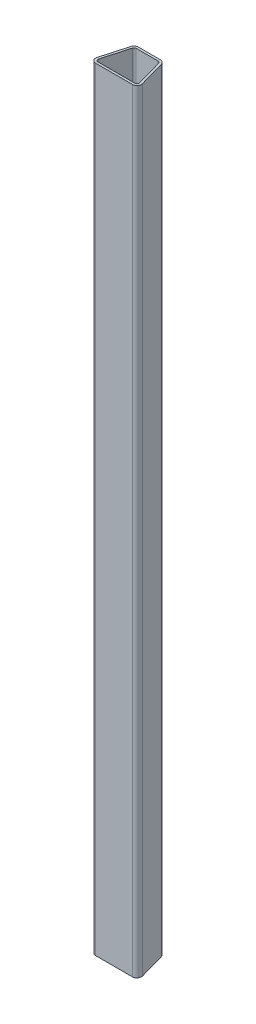
ISO-10303-21;
HEADER;
FILE_DESCRIPTION(('STEP AP214'),'2;1');
FILE_NAME('part.step','',(''),(''),'','','');
FILE_SCHEMA(('AUTOMOTIVE_DESIGN { 1 0 10303 214 1 1 1 1 }'));
ENDSEC;
DATA;
#1=APPLICATION_CONTEXT('core data for automotive mechanical design processes');
#2=APPLICATION_PROTOCOL_DEFINITION('international standard','automotive_design',2000,#1);
#3=PRODUCT_CONTEXT('',#1,'mechanical');
#4=PRODUCT('Part','Part','',(#3));
#5=PRODUCT_RELATED_PRODUCT_CATEGORY('part','',(#4));
#6=PRODUCT_DEFINITION_FORMATION('','',#4);
#7=PRODUCT_DEFINITION_CONTEXT('part definition',#1,'design');
#8=PRODUCT_DEFINITION('design','',#6,#7);
#9=PRODUCT_DEFINITION_SHAPE('','',#8);
#10=(LENGTH_UNIT() NAMED_UNIT(*) SI_UNIT(.MILLI.,.METRE.));
#11=(NAMED_UNIT(*) PLANE_ANGLE_UNIT() SI_UNIT($,.RADIAN.));
#12=(NAMED_UNIT(*) SI_UNIT($,.STERADIAN.) SOLID_ANGLE_UNIT());
#13=UNCERTAINTY_MEASURE_WITH_UNIT(LENGTH_MEASURE(1.E-05),#10,'distance_accuracy_value','');
#14=(GEOMETRIC_REPRESENTATION_CONTEXT(3) GLOBAL_UNCERTAINTY_ASSIGNED_CONTEXT((#13)) GLOBAL_UNIT_ASSIGNED_CONTEXT((#10,
#11,#12)) REPRESENTATION_CONTEXT('',''));
#15=CARTESIAN_POINT('',(0.,0.,0.));
#16=DIRECTION('',(0.,0.,1.));
#17=DIRECTION('',(1.,0.,0.));
#18=AXIS2_PLACEMENT_3D('',#15,#16,#17);
#19=CARTESIAN_POINT('',(-4.98490373267567,350.,-6.));
#20=DIRECTION('',(0.,-1.,0.));
#21=DIRECTION('',(0.,0.,-1.));
#22=AXIS2_PLACEMENT_3D('',#19,#20,#21);
#23=CYLINDRICAL_SURFACE('',#22,0.999999999999999);
#24=DIRECTION('',(0.,1.,0.));
#25=VECTOR('',#24,1.);
#26=CARTESIAN_POINT('',(-4.98490373267567,350.,-7.));
#27=LINE('',#26,#25);
#28=CARTESIAN_POINT('',(-4.98490373267567,350.,-7.));
#29=VERTEX_POINT('',#28);
#30=CARTESIAN_POINT('',(-4.98490373267567,0.,-7.));
#31=VERTEX_POINT('',#30);
#32=EDGE_CURVE('E134',#29,#31,#27,.F.);
#33=ORIENTED_EDGE('',*,*,#32,.F.);
#34=CARTESIAN_POINT('',(-4.98490373267567,350.,-6.));
#35=DIRECTION('',(0.,-1.,0.));
#36=DIRECTION('',(0.,0.,-1.));
#37=AXIS2_PLACEMENT_3D('',#34,#35,#36);
#38=CIRCLE('',#37,0.999999999999999);
#39=CARTESIAN_POINT('',(-5.94755467282956,350.,-6.27074557691828));
#40=VERTEX_POINT('',#39);
#41=EDGE_CURVE('E20',#40,#29,#38,.T.);
#42=ORIENTED_EDGE('',*,*,#41,.F.);
#43=DIRECTION('',(0.,1.,0.));
#44=VECTOR('',#43,1.);
#45=CARTESIAN_POINT('',(-5.94755467282956,350.,-6.27074557691828));
#46=LINE('',#45,#44);
#47=CARTESIAN_POINT('',(-5.94755467282956,0.,-6.27074557691828));
#48=VERTEX_POINT('',#47);
#49=EDGE_CURVE('E179',#48,#40,#46,.T.);
#50=ORIENTED_EDGE('',*,*,#49,.F.);
#51=CARTESIAN_POINT('',(-4.98490373267567,0.,-6.));
#52=DIRECTION('',(0.,-1.,0.));
#53=DIRECTION('',(0.,0.,-1.));
#54=AXIS2_PLACEMENT_3D('',#51,#52,#53);
#55=CIRCLE('',#54,0.999999999999999);
#56=EDGE_CURVE('E132',#31,#48,#55,.F.);
#57=ORIENTED_EDGE('',*,*,#56,.F.);
#58=EDGE_LOOP('',(#33,#42,#50,#57));
#59=FACE_BOUND('',#58,.T.);
#60=ADVANCED_FACE('F17',(#59),#23,.F.);
#61=CARTESIAN_POINT('',(4.98490373267567,350.,-6.));
#62=DIRECTION('',(0.,-1.,0.));
#63=DIRECTION('',(0.,0.,-1.));
#64=AXIS2_PLACEMENT_3D('',#61,#62,#63);
#65=CYLINDRICAL_SURFACE('',#64,0.999999999999998);
#66=DIRECTION('',(0.,1.,0.));
#67=VECTOR('',#66,1.);
#68=CARTESIAN_POINT('',(5.94755467282956,350.,-6.27074557691828));
#69=LINE('',#68,#67);
#70=CARTESIAN_POINT('',(5.94755467282956,350.,-6.27074557691828));
#71=VERTEX_POINT('',#70);
#72=CARTESIAN_POINT('',(5.94755467282956,0.,-6.27074557691828));
#73=VERTEX_POINT('',#72);
#74=EDGE_CURVE('E138',#71,#73,#69,.F.);
#75=ORIENTED_EDGE('',*,*,#74,.F.);
#76=CARTESIAN_POINT('',(4.98490373267567,350.,-6.));
#77=DIRECTION('',(0.,-1.,0.));
#78=DIRECTION('',(0.,0.,-1.));
#79=AXIS2_PLACEMENT_3D('',#76,#77,#78);
#80=CIRCLE('',#79,0.999999999999998);
#81=CARTESIAN_POINT('',(4.98490373267567,350.,-7.));
#82=VERTEX_POINT('',#81);
#83=EDGE_CURVE('E227',#82,#71,#80,.T.);
#84=ORIENTED_EDGE('',*,*,#83,.F.);
#85=DIRECTION('',(0.,1.,0.));
#86=VECTOR('',#85,1.);
#87=CARTESIAN_POINT('',(4.98490373267567,350.,-7.));
#88=LINE('',#87,#86);
#89=CARTESIAN_POINT('',(4.98490373267567,0.,-7.));
#90=VERTEX_POINT('',#89);
#91=EDGE_CURVE('E139',#90,#82,#88,.T.);
#92=ORIENTED_EDGE('',*,*,#91,.F.);
#93=CARTESIAN_POINT('',(4.98490373267567,0.,-6.));
#94=DIRECTION('',(0.,-1.,0.));
#95=DIRECTION('',(0.,0.,-1.));
#96=AXIS2_PLACEMENT_3D('',#93,#94,#95);
#97=CIRCLE('',#96,0.999999999999998);
#98=EDGE_CURVE('E195',#73,#90,#97,.F.);
#99=ORIENTED_EDGE('',*,*,#98,.F.);
#100=EDGE_LOOP('',(#75,#84,#92,#99));
#101=FACE_BOUND('',#100,.T.);
#102=ADVANCED_FACE('F425',(#101),#65,.F.);
#103=CARTESIAN_POINT('',(6.91020561298346,350.,-6.54149115383657));
#104=DIRECTION('',(-0.962650940153899,0.,0.270745576918284));
#105=DIRECTION('',(0.270745576918284,0.,0.962650940153899));
#106=AXIS2_PLACEMENT_3D('',#103,#104,#105);
#107=PLANE('',#106);
#108=DIRECTION('',(0.,-1.,0.));
#109=VECTOR('',#108,1.);
#110=CARTESIAN_POINT('',(6.91020561298346,350.,-6.54149115383657));
#111=LINE('',#110,#109);
#112=CARTESIAN_POINT('',(6.91020561298346,350.,-6.54149115383657));
#113=VERTEX_POINT('',#112);
#114=CARTESIAN_POINT('',(6.91020561298346,0.,-6.54149115383657));
#115=VERTEX_POINT('',#114);
#116=EDGE_CURVE('E193',#113,#115,#111,.T.);
#117=ORIENTED_EDGE('',*,*,#116,.F.);
#118=DIRECTION('',(-0.270745576918284,0.,-0.962650940153899));
#119=VECTOR('',#118,1.);
#120=CARTESIAN_POINT('',(10.2852056129835,350.,5.45850884616343));
#121=LINE('',#120,#119);
#122=CARTESIAN_POINT('',(10.2852056129835,350.,5.45850884616343));
#123=VERTEX_POINT('',#122);
#124=EDGE_CURVE('E161',#123,#113,#121,.T.);
#125=ORIENTED_EDGE('',*,*,#124,.F.);
#126=DIRECTION('',(0.,-1.,0.));
#127=VECTOR('',#126,1.);
#128=CARTESIAN_POINT('',(10.2852056129835,350.,5.45850884616343));
#129=LINE('',#128,#127);
#130=CARTESIAN_POINT('',(10.2852056129835,0.,5.45850884616343));
#131=VERTEX_POINT('',#130);
#132=EDGE_CURVE('E182',#131,#123,#129,.F.);
#133=ORIENTED_EDGE('',*,*,#132,.F.);
#134=DIRECTION('',(-0.270745576918284,0.,-0.962650940153899));
#135=VECTOR('',#134,1.);
#136=CARTESIAN_POINT('',(10.2852056129835,0.,5.45850884616343));
#137=LINE('',#136,#135);
#138=EDGE_CURVE('E218',#131,#115,#137,.T.);
#139=ORIENTED_EDGE('',*,*,#138,.T.);
#140=EDGE_LOOP('',(#117,#125,#133,#139));
#141=FACE_BOUND('',#140,.T.);
#142=ADVANCED_FACE('F269',(#141),#107,.F.);
#143=CARTESIAN_POINT('',(4.98490373267567,350.,-6.));
#144=DIRECTION('',(0.,-1.,0.));
#145=DIRECTION('',(0.,0.,-1.));
#146=AXIS2_PLACEMENT_3D('',#143,#144,#145);
#147=CYLINDRICAL_SURFACE('',#146,2.);
#148=CARTESIAN_POINT('',(4.98490373267567,350.,-6.));
#149=DIRECTION('',(0.,-1.,0.));
#150=DIRECTION('',(0.,0.,-1.));
#151=AXIS2_PLACEMENT_3D('',#148,#149,#150);
#152=CIRCLE('',#151,2.);
#153=CARTESIAN_POINT('',(4.98490373267567,350.,-8.));
#154=VERTEX_POINT('',#153);
#155=EDGE_CURVE('E160',#113,#154,#152,.F.);
#156=ORIENTED_EDGE('',*,*,#155,.F.);
#157=ORIENTED_EDGE('',*,*,#116,.T.);
#158=CARTESIAN_POINT('',(4.98490373267567,0.,-6.));
#159=DIRECTION('',(0.,-1.,0.));
#160=DIRECTION('',(0.,0.,-1.));
#161=AXIS2_PLACEMENT_3D('',#158,#159,#160);
#162=CIRCLE('',#161,2.);
#163=CARTESIAN_POINT('',(4.98490373267567,0.,-8.));
#164=VERTEX_POINT('',#163);
#165=EDGE_CURVE('E215',#115,#164,#162,.F.);
#166=ORIENTED_EDGE('',*,*,#165,.T.);
#167=DIRECTION('',(0.,1.,0.));
#168=VECTOR('',#167,1.);
#169=CARTESIAN_POINT('',(4.98490373267567,350.,-8.));
#170=LINE('',#169,#168);
#171=EDGE_CURVE('E190',#164,#154,#170,.T.);
#172=ORIENTED_EDGE('',*,*,#171,.T.);
#173=EDGE_LOOP('',(#156,#157,#166,#172));
#174=FACE_BOUND('',#173,.T.);
#175=ADVANCED_FACE('F274',(#174),#147,.T.);
#176=CARTESIAN_POINT('',(-4.98490373267567,350.,-8.));
#177=DIRECTION('',(0.,0.,1.));
#178=DIRECTION('',(1.,0.,0.));
#179=AXIS2_PLACEMENT_3D('',#176,#177,#178);
#180=PLANE('',#179);
#181=DIRECTION('',(0.,-1.,0.));
#182=VECTOR('',#181,1.);
#183=CARTESIAN_POINT('',(-4.98490373267567,350.,-8.));
#184=LINE('',#183,#182);
#185=CARTESIAN_POINT('',(-4.98490373267567,350.,-8.));
#186=VERTEX_POINT('',#185);
#187=CARTESIAN_POINT('',(-4.98490373267567,0.,-8.));
#188=VERTEX_POINT('',#187);
#189=EDGE_CURVE('E188',#186,#188,#184,.T.);
#190=ORIENTED_EDGE('',*,*,#189,.F.);
#191=DIRECTION('',(1.,0.,0.));
#192=VECTOR('',#191,1.);
#193=CARTESIAN_POINT('',(8.35990373267567,350.,-8.));
#194=LINE('',#193,#192);
#195=EDGE_CURVE('E158',#154,#186,#194,.F.);
#196=ORIENTED_EDGE('',*,*,#195,.F.);
#197=ORIENTED_EDGE('',*,*,#171,.F.);
#198=DIRECTION('',(1.,0.,0.));
#199=VECTOR('',#198,1.);
#200=CARTESIAN_POINT('',(8.35990373267567,0.,-8.));
#201=LINE('',#200,#199);
#202=EDGE_CURVE('E214',#164,#188,#201,.F.);
#203=ORIENTED_EDGE('',*,*,#202,.T.);
#204=EDGE_LOOP('',(#190,#196,#197,#203));
#205=FACE_BOUND('',#204,.T.);
#206=ADVANCED_FACE('F278',(#205),#180,.F.);
#207=CARTESIAN_POINT('',(-4.98490373267567,350.,-6.));
#208=DIRECTION('',(0.,-1.,0.));
#209=DIRECTION('',(0.,0.,-1.));
#210=AXIS2_PLACEMENT_3D('',#207,#208,#209);
#211=CYLINDRICAL_SURFACE('',#210,2.);
#212=CARTESIAN_POINT('',(-4.98490373267567,350.,-6.));
#213=DIRECTION('',(0.,-1.,0.));
#214=DIRECTION('',(0.,0.,-1.));
#215=AXIS2_PLACEMENT_3D('',#212,#213,#214);
#216=CIRCLE('',#215,2.);
#217=CARTESIAN_POINT('',(-6.91020561298346,350.,-6.54149115383657));
#218=VERTEX_POINT('',#217);
#219=EDGE_CURVE('E157',#186,#218,#216,.F.);
#220=ORIENTED_EDGE('',*,*,#219,.F.);
#221=ORIENTED_EDGE('',*,*,#189,.T.);
#222=CARTESIAN_POINT('',(-4.98490373267567,0.,-6.));
#223=DIRECTION('',(0.,-1.,0.));
#224=DIRECTION('',(0.,0.,-1.));
#225=AXIS2_PLACEMENT_3D('',#222,#223,#224);
#226=CIRCLE('',#225,2.);
#227=CARTESIAN_POINT('',(-6.91020561298346,0.,-6.54149115383657));
#228=VERTEX_POINT('',#227);
#229=EDGE_CURVE('E211',#188,#228,#226,.F.);
#230=ORIENTED_EDGE('',*,*,#229,.T.);
#231=DIRECTION('',(0.,1.,0.));
#232=VECTOR('',#231,1.);
#233=CARTESIAN_POINT('',(-6.91020561298346,350.,-6.54149115383657));
#234=LINE('',#233,#232);
#235=EDGE_CURVE('E181',#228,#218,#234,.T.);
#236=ORIENTED_EDGE('',*,*,#235,.T.);
#237=EDGE_LOOP('',(#220,#221,#230,#236));
#238=FACE_BOUND('',#237,.T.);
#239=ADVANCED_FACE('F282',(#238),#211,.T.);
#240=CARTESIAN_POINT('',(-6.91020561298346,350.,-6.54149115383657));
#241=DIRECTION('',(0.962650940153899,0.,0.270745576918284));
#242=DIRECTION('',(0.270745576918284,0.,-0.962650940153899));
#243=AXIS2_PLACEMENT_3D('',#240,#241,#242);
#244=PLANE('',#243);
#245=DIRECTION('',(0.,-1.,0.));
#246=VECTOR('',#245,1.);
#247=CARTESIAN_POINT('',(-10.2852056129835,350.,5.45850884616343));
#248=LINE('',#247,#246);
#249=CARTESIAN_POINT('',(-10.2852056129835,350.,5.45850884616343));
#250=VERTEX_POINT('',#249);
#251=CARTESIAN_POINT('',(-10.2852056129835,0.,5.45850884616343));
#252=VERTEX_POINT('',#251);
#253=EDGE_CURVE('E163',#250,#252,#248,.T.);
#254=ORIENTED_EDGE('',*,*,#253,.F.);
#255=DIRECTION('',(-0.270745576918284,0.,0.962650940153899));
#256=VECTOR('',#255,1.);
#257=CARTESIAN_POINT('',(-6.91020561298346,350.,-6.54149115383657));
#258=LINE('',#257,#256);
#259=EDGE_CURVE('E155',#218,#250,#258,.T.);
#260=ORIENTED_EDGE('',*,*,#259,.F.);
#261=ORIENTED_EDGE('',*,*,#235,.F.);
#262=DIRECTION('',(-0.270745576918284,0.,0.962650940153899));
#263=VECTOR('',#262,1.);
#264=CARTESIAN_POINT('',(-6.91020561298346,0.,-6.54149115383657));
#265=LINE('',#264,#263);
#266=EDGE_CURVE('E210',#228,#252,#265,.T.);
#267=ORIENTED_EDGE('',*,*,#266,.T.);
#268=EDGE_LOOP('',(#254,#260,#261,#267));
#269=FACE_BOUND('',#268,.T.);
#270=ADVANCED_FACE('F285',(#269),#244,.F.);
#271=CARTESIAN_POINT('',(-5.94755467282956,350.,-6.27074557691828));
#272=DIRECTION('',(0.962650940153899,0.,0.270745576918284));
#273=DIRECTION('',(0.270745576918284,0.,-0.962650940153899));
#274=AXIS2_PLACEMENT_3D('',#271,#272,#273);
#275=PLANE('',#274);
#276=DIRECTION('',(0.270745576918284,0.,-0.962650940153899));
#277=VECTOR('',#276,1.);
#278=CARTESIAN_POINT('',(-9.32255467282957,350.,5.72925442308172));
#279=LINE('',#278,#277);
#280=CARTESIAN_POINT('',(-9.32255467282957,350.,5.72925442308172));
#281=VERTEX_POINT('',#280);
#282=EDGE_CURVE('E131',#281,#40,#279,.T.);
#283=ORIENTED_EDGE('',*,*,#282,.F.);
#284=DIRECTION('',(0.,-1.,0.));
#285=VECTOR('',#284,1.);
#286=CARTESIAN_POINT('',(-9.32255467282956,350.,5.72925442308172));
#287=LINE('',#286,#285);
#288=CARTESIAN_POINT('',(-9.32255467282957,0.,5.72925442308172));
#289=VERTEX_POINT('',#288);
#290=EDGE_CURVE('E164',#281,#289,#287,.T.);
#291=ORIENTED_EDGE('',*,*,#290,.T.);
#292=DIRECTION('',(0.270745576918284,0.,-0.962650940153899));
#293=VECTOR('',#292,1.);
#294=CARTESIAN_POINT('',(-9.32255467282957,0.,5.72925442308172));
#295=LINE('',#294,#293);
#296=EDGE_CURVE('E206',#289,#48,#295,.T.);
#297=ORIENTED_EDGE('',*,*,#296,.T.);
#298=ORIENTED_EDGE('',*,*,#49,.T.);
#299=EDGE_LOOP('',(#283,#291,#297,#298));
#300=FACE_BOUND('',#299,.T.);
#301=ADVANCED_FACE('F236',(#300),#275,.T.);
#302=CARTESIAN_POINT('',(-4.98490373267567,350.,-7.));
#303=DIRECTION('',(0.,0.,1.));
#304=DIRECTION('',(1.,0.,0.));
#305=AXIS2_PLACEMENT_3D('',#302,#303,#304);
#306=PLANE('',#305);
#307=DIRECTION('',(1.,0.,0.));
#308=VECTOR('',#307,1.);
#309=CARTESIAN_POINT('',(8.35990373267567,350.,-7.));
#310=LINE('',#309,#308);
#311=EDGE_CURVE('E128',#29,#82,#310,.T.);
#312=ORIENTED_EDGE('',*,*,#311,.F.);
#313=ORIENTED_EDGE('',*,*,#32,.T.);
#314=DIRECTION('',(1.,0.,0.));
#315=VECTOR('',#314,1.);
#316=CARTESIAN_POINT('',(8.35990373267567,0.,-7.));
#317=LINE('',#316,#315);
#318=EDGE_CURVE('E234',#31,#90,#317,.T.);
#319=ORIENTED_EDGE('',*,*,#318,.T.);
#320=ORIENTED_EDGE('',*,*,#91,.T.);
#321=EDGE_LOOP('',(#312,#313,#319,#320));
#322=FACE_BOUND('',#321,.T.);
#323=ADVANCED_FACE('F142',(#322),#306,.T.);
#324=CARTESIAN_POINT('',(5.94755467282956,350.,-6.27074557691828));
#325=DIRECTION('',(-0.962650940153899,0.,0.270745576918284));
#326=DIRECTION('',(0.270745576918284,0.,0.962650940153899));
#327=AXIS2_PLACEMENT_3D('',#324,#325,#326);
#328=PLANE('',#327);
#329=DIRECTION('',(0.270745576918284,0.,0.962650940153899));
#330=VECTOR('',#329,1.);
#331=CARTESIAN_POINT('',(5.94755467282956,350.,-6.27074557691828));
#332=LINE('',#331,#330);
#333=CARTESIAN_POINT('',(9.32255467282957,350.,5.72925442308172));
#334=VERTEX_POINT('',#333);
#335=EDGE_CURVE('E144',#71,#334,#332,.T.);
#336=ORIENTED_EDGE('',*,*,#335,.F.);
#337=ORIENTED_EDGE('',*,*,#74,.T.);
#338=DIRECTION('',(0.270745576918284,0.,0.962650940153899));
#339=VECTOR('',#338,1.);
#340=CARTESIAN_POINT('',(5.94755467282956,0.,-6.27074557691828));
#341=LINE('',#340,#339);
#342=CARTESIAN_POINT('',(9.32255467282956,0.,5.72925442308172));
#343=VERTEX_POINT('',#342);
#344=EDGE_CURVE('E204',#73,#343,#341,.T.);
#345=ORIENTED_EDGE('',*,*,#344,.T.);
#346=DIRECTION('',(0.,-1.,0.));
#347=VECTOR('',#346,1.);
#348=CARTESIAN_POINT('',(9.32255467282956,350.,5.72925442308172));
#349=LINE('',#348,#347);
#350=EDGE_CURVE('E173',#343,#334,#349,.F.);
#351=ORIENTED_EDGE('',*,*,#350,.T.);
#352=EDGE_LOOP('',(#336,#337,#345,#351));
#353=FACE_BOUND('',#352,.T.);
#354=ADVANCED_FACE('F319',(#353),#328,.T.);
#355=CARTESIAN_POINT('',(8.35990373267567,350.,6.));
#356=DIRECTION('',(0.,-1.,0.));
#357=DIRECTION('',(0.,0.,-1.));
#358=AXIS2_PLACEMENT_3D('',#355,#356,#357);
#359=CYLINDRICAL_SURFACE('',#358,1.);
#360=DIRECTION('',(0.,1.,0.));
#361=VECTOR('',#360,1.);
#362=CARTESIAN_POINT('',(8.35990373267567,350.,7.));
#363=LINE('',#362,#361);
#364=CARTESIAN_POINT('',(8.35990373267567,350.,7.));
#365=VERTEX_POINT('',#364);
#366=CARTESIAN_POINT('',(8.35990373267567,0.,7.));
#367=VERTEX_POINT('',#366);
#368=EDGE_CURVE('E170',#365,#367,#363,.F.);
#369=ORIENTED_EDGE('',*,*,#368,.F.);
#370=CARTESIAN_POINT('',(8.35990373267567,350.,6.));
#371=DIRECTION('',(0.,-1.,0.));
#372=DIRECTION('',(0.,0.,-1.));
#373=AXIS2_PLACEMENT_3D('',#370,#371,#372);
#374=CIRCLE('',#373,1.);
#375=EDGE_CURVE('E146',#334,#365,#374,.T.);
#376=ORIENTED_EDGE('',*,*,#375,.F.);
#377=ORIENTED_EDGE('',*,*,#350,.F.);
#378=CARTESIAN_POINT('',(8.35990373267567,0.,6.));
#379=DIRECTION('',(0.,-1.,0.));
#380=DIRECTION('',(0.,0.,-1.));
#381=AXIS2_PLACEMENT_3D('',#378,#379,#380);
#382=CIRCLE('',#381,1.);
#383=EDGE_CURVE('E201',#343,#367,#382,.T.);
#384=ORIENTED_EDGE('',*,*,#383,.T.);
#385=EDGE_LOOP('',(#369,#376,#377,#384));
#386=FACE_BOUND('',#385,.T.);
#387=ADVANCED_FACE('F315',(#386),#359,.F.);
#388=CARTESIAN_POINT('',(-8.35990373267567,350.,7.));
#389=DIRECTION('',(0.,0.,-1.));
#390=DIRECTION('',(-1.,0.,0.));
#391=AXIS2_PLACEMENT_3D('',#388,#389,#390);
#392=PLANE('',#391);
#393=DIRECTION('',(1.,0.,0.));
#394=VECTOR('',#393,1.);
#395=CARTESIAN_POINT('',(8.35990373267567,350.,7.));
#396=LINE('',#395,#394);
#397=CARTESIAN_POINT('',(-8.35990373267567,350.,7.));
#398=VERTEX_POINT('',#397);
#399=EDGE_CURVE('E152',#365,#398,#396,.F.);
#400=ORIENTED_EDGE('',*,*,#399,.F.);
#401=ORIENTED_EDGE('',*,*,#368,.T.);
#402=DIRECTION('',(1.,0.,0.));
#403=VECTOR('',#402,1.);
#404=CARTESIAN_POINT('',(8.35990373267567,0.,7.));
#405=LINE('',#404,#403);
#406=CARTESIAN_POINT('',(-8.35990373267567,0.,7.));
#407=VERTEX_POINT('',#406);
#408=EDGE_CURVE('E200',#367,#407,#405,.F.);
#409=ORIENTED_EDGE('',*,*,#408,.T.);
#410=DIRECTION('',(0.,-1.,0.));
#411=VECTOR('',#410,1.);
#412=CARTESIAN_POINT('',(-8.35990373267567,350.,7.));
#413=LINE('',#412,#411);
#414=EDGE_CURVE('E167',#407,#398,#413,.F.);
#415=ORIENTED_EDGE('',*,*,#414,.T.);
#416=EDGE_LOOP('',(#400,#401,#409,#415));
#417=FACE_BOUND('',#416,.T.);
#418=ADVANCED_FACE('F311',(#417),#392,.T.);
#419=CARTESIAN_POINT('',(-8.35990373267567,350.,6.));
#420=DIRECTION('',(0.,-1.,0.));
#421=DIRECTION('',(0.,0.,-1.));
#422=AXIS2_PLACEMENT_3D('',#419,#420,#421);
#423=CYLINDRICAL_SURFACE('',#422,1.);
#424=ORIENTED_EDGE('',*,*,#290,.F.);
#425=CARTESIAN_POINT('',(-8.35990373267567,350.,6.));
#426=DIRECTION('',(0.,-1.,0.));
#427=DIRECTION('',(0.,0.,-1.));
#428=AXIS2_PLACEMENT_3D('',#425,#426,#427);
#429=CIRCLE('',#428,1.);
#430=EDGE_CURVE('E148',#398,#281,#429,.T.);
#431=ORIENTED_EDGE('',*,*,#430,.F.);
#432=ORIENTED_EDGE('',*,*,#414,.F.);
#433=CARTESIAN_POINT('',(-8.35990373267567,0.,6.));
#434=DIRECTION('',(0.,-1.,0.));
#435=DIRECTION('',(0.,0.,-1.));
#436=AXIS2_PLACEMENT_3D('',#433,#434,#435);
#437=CIRCLE('',#436,1.);
#438=EDGE_CURVE('E196',#407,#289,#437,.T.);
#439=ORIENTED_EDGE('',*,*,#438,.T.);
#440=EDGE_LOOP('',(#424,#431,#432,#439));
#441=FACE_BOUND('',#440,.T.);
#442=ADVANCED_FACE('F308',(#441),#423,.F.);
#443=CARTESIAN_POINT('',(-8.35990373267567,350.,6.));
#444=DIRECTION('',(0.,-1.,0.));
#445=DIRECTION('',(0.,0.,-1.));
#446=AXIS2_PLACEMENT_3D('',#443,#444,#445);
#447=CYLINDRICAL_SURFACE('',#446,2.);
#448=CARTESIAN_POINT('',(-8.35990373267567,350.,6.));
#449=DIRECTION('',(0.,-1.,0.));
#450=DIRECTION('',(0.,0.,-1.));
#451=AXIS2_PLACEMENT_3D('',#448,#449,#450);
#452=CIRCLE('',#451,2.);
#453=CARTESIAN_POINT('',(-8.35990373267567,350.,8.));
#454=VERTEX_POINT('',#453);
#455=EDGE_CURVE('E154',#250,#454,#452,.F.);
#456=ORIENTED_EDGE('',*,*,#455,.F.);
#457=ORIENTED_EDGE('',*,*,#253,.T.);
#458=CARTESIAN_POINT('',(-8.35990373267567,0.,6.));
#459=DIRECTION('',(0.,-1.,0.));
#460=DIRECTION('',(0.,0.,-1.));
#461=AXIS2_PLACEMENT_3D('',#458,#459,#460);
#462=CIRCLE('',#461,2.);
#463=CARTESIAN_POINT('',(-8.35990373267567,0.,8.));
#464=VERTEX_POINT('',#463);
#465=EDGE_CURVE('E207',#252,#464,#462,.F.);
#466=ORIENTED_EDGE('',*,*,#465,.T.);
#467=DIRECTION('',(0.,1.,0.));
#468=VECTOR('',#467,1.);
#469=CARTESIAN_POINT('',(-8.35990373267567,350.,8.));
#470=LINE('',#469,#468);
#471=EDGE_CURVE('E199',#464,#454,#470,.T.);
#472=ORIENTED_EDGE('',*,*,#471,.T.);
#473=EDGE_LOOP('',(#456,#457,#466,#472));
#474=FACE_BOUND('',#473,.T.);
#475=ADVANCED_FACE('F259',(#474),#447,.T.);
#476=CARTESIAN_POINT('',(8.35990373267567,350.,6.));
#477=DIRECTION('',(0.,1.,0.));
#478=DIRECTION('',(0.,0.,1.));
#479=AXIS2_PLACEMENT_3D('',#476,#477,#478);
#480=PLANE('',#479);
#481=ORIENTED_EDGE('',*,*,#335,.T.);
#482=ORIENTED_EDGE('',*,*,#375,.T.);
#483=ORIENTED_EDGE('',*,*,#399,.T.);
#484=ORIENTED_EDGE('',*,*,#430,.T.);
#485=ORIENTED_EDGE('',*,*,#282,.T.);
#486=ORIENTED_EDGE('',*,*,#41,.T.);
#487=ORIENTED_EDGE('',*,*,#311,.T.);
#488=ORIENTED_EDGE('',*,*,#83,.T.);
#489=EDGE_LOOP('',(#481,#482,#483,#484,#485,#486,#487,#488));
#490=FACE_BOUND('',#489,.T.);
#491=ORIENTED_EDGE('',*,*,#455,.T.);
#492=DIRECTION('',(-1.,0.,0.));
#493=VECTOR('',#492,1.);
#494=CARTESIAN_POINT('',(-8.35990373267567,350.,8.));
#495=LINE('',#494,#493);
#496=CARTESIAN_POINT('',(8.35990373267567,350.,8.));
#497=VERTEX_POINT('',#496);
#498=EDGE_CURVE('E248',#454,#497,#495,.F.);
#499=ORIENTED_EDGE('',*,*,#498,.T.);
#500=CARTESIAN_POINT('',(8.35990373267567,350.,6.));
#501=DIRECTION('',(0.,-1.,0.));
#502=DIRECTION('',(0.,0.,-1.));
#503=AXIS2_PLACEMENT_3D('',#500,#501,#502);
#504=CIRCLE('',#503,2.);
#505=EDGE_CURVE('E184',#123,#497,#504,.T.);
#506=ORIENTED_EDGE('',*,*,#505,.F.);
#507=ORIENTED_EDGE('',*,*,#124,.T.);
#508=ORIENTED_EDGE('',*,*,#155,.T.);
#509=ORIENTED_EDGE('',*,*,#195,.T.);
#510=ORIENTED_EDGE('',*,*,#219,.T.);
#511=ORIENTED_EDGE('',*,*,#259,.T.);
#512=EDGE_LOOP('',(#491,#499,#506,#507,#508,#509,#510,#511));
#513=FACE_BOUND('',#512,.T.);
#514=ADVANCED_FACE('F125',(#490,#513),#480,.T.);
#515=CARTESIAN_POINT('',(8.35990373267567,350.,6.));
#516=DIRECTION('',(0.,-1.,0.));
#517=DIRECTION('',(0.,0.,-1.));
#518=AXIS2_PLACEMENT_3D('',#515,#516,#517);
#519=CYLINDRICAL_SURFACE('',#518,2.);
#520=ORIENTED_EDGE('',*,*,#505,.T.);
#521=DIRECTION('',(0.,1.,0.));
#522=VECTOR('',#521,1.);
#523=CARTESIAN_POINT('',(8.35990373267567,350.,8.));
#524=LINE('',#523,#522);
#525=CARTESIAN_POINT('',(8.35990373267567,0.,8.));
#526=VERTEX_POINT('',#525);
#527=EDGE_CURVE('E26',#497,#526,#524,.F.);
#528=ORIENTED_EDGE('',*,*,#527,.T.);
#529=CARTESIAN_POINT('',(8.35990373267567,0.,6.));
#530=DIRECTION('',(0.,-1.,0.));
#531=DIRECTION('',(0.,0.,-1.));
#532=AXIS2_PLACEMENT_3D('',#529,#530,#531);
#533=CIRCLE('',#532,2.);
#534=EDGE_CURVE('E34',#526,#131,#533,.F.);
#535=ORIENTED_EDGE('',*,*,#534,.T.);
#536=ORIENTED_EDGE('',*,*,#132,.T.);
#537=EDGE_LOOP('',(#520,#528,#535,#536));
#538=FACE_BOUND('',#537,.T.);
#539=ADVANCED_FACE('F264',(#538),#519,.T.);
#540=CARTESIAN_POINT('',(8.35990373267567,0.,6.));
#541=DIRECTION('',(0.,1.,0.));
#542=DIRECTION('',(0.,0.,1.));
#543=AXIS2_PLACEMENT_3D('',#540,#541,#542);
#544=PLANE('',#543);
#545=ORIENTED_EDGE('',*,*,#408,.F.);
#546=ORIENTED_EDGE('',*,*,#383,.F.);
#547=ORIENTED_EDGE('',*,*,#344,.F.);
#548=ORIENTED_EDGE('',*,*,#98,.T.);
#549=ORIENTED_EDGE('',*,*,#318,.F.);
#550=ORIENTED_EDGE('',*,*,#56,.T.);
#551=ORIENTED_EDGE('',*,*,#296,.F.);
#552=ORIENTED_EDGE('',*,*,#438,.F.);
#553=EDGE_LOOP('',(#545,#546,#547,#548,#549,#550,#551,#552));
#554=FACE_BOUND('',#553,.T.);
#555=DIRECTION('',(-1.,0.,0.));
#556=VECTOR('',#555,1.);
#557=CARTESIAN_POINT('',(-8.35990373267567,0.,8.));
#558=LINE('',#557,#556);
#559=EDGE_CURVE('E11',#526,#464,#558,.T.);
#560=ORIENTED_EDGE('',*,*,#559,.T.);
#561=ORIENTED_EDGE('',*,*,#465,.F.);
#562=ORIENTED_EDGE('',*,*,#266,.F.);
#563=ORIENTED_EDGE('',*,*,#229,.F.);
#564=ORIENTED_EDGE('',*,*,#202,.F.);
#565=ORIENTED_EDGE('',*,*,#165,.F.);
#566=ORIENTED_EDGE('',*,*,#138,.F.);
#567=ORIENTED_EDGE('',*,*,#534,.F.);
#568=EDGE_LOOP('',(#560,#561,#562,#563,#564,#565,#566,#567));
#569=FACE_BOUND('',#568,.T.);
#570=ADVANCED_FACE('F231',(#554,#569),#544,.F.);
#571=CARTESIAN_POINT('',(-8.35990373267567,350.,8.));
#572=DIRECTION('',(0.,0.,-1.));
#573=DIRECTION('',(-1.,0.,0.));
#574=AXIS2_PLACEMENT_3D('',#571,#572,#573);
#575=PLANE('',#574);
#576=ORIENTED_EDGE('',*,*,#527,.F.);
#577=ORIENTED_EDGE('',*,*,#498,.F.);
#578=ORIENTED_EDGE('',*,*,#471,.F.);
#579=ORIENTED_EDGE('',*,*,#559,.F.);
#580=EDGE_LOOP('',(#576,#577,#578,#579));
#581=FACE_BOUND('',#580,.T.);
#582=ADVANCED_FACE('F257',(#581),#575,.F.);
#583=CLOSED_SHELL('',(#60,#102,#142,#175,#206,#239,#270,#301,#323,#354,#387,#418,#442,#475,#514,
#539,#570,#582));
#584=MANIFOLD_SOLID_BREP('B1',#583);
#585=ADVANCED_BREP_SHAPE_REPRESENTATION('',(#18,#584),#14);
#586=SHAPE_DEFINITION_REPRESENTATION(#9,#585);
ENDSEC;
END-ISO-10303-21;
